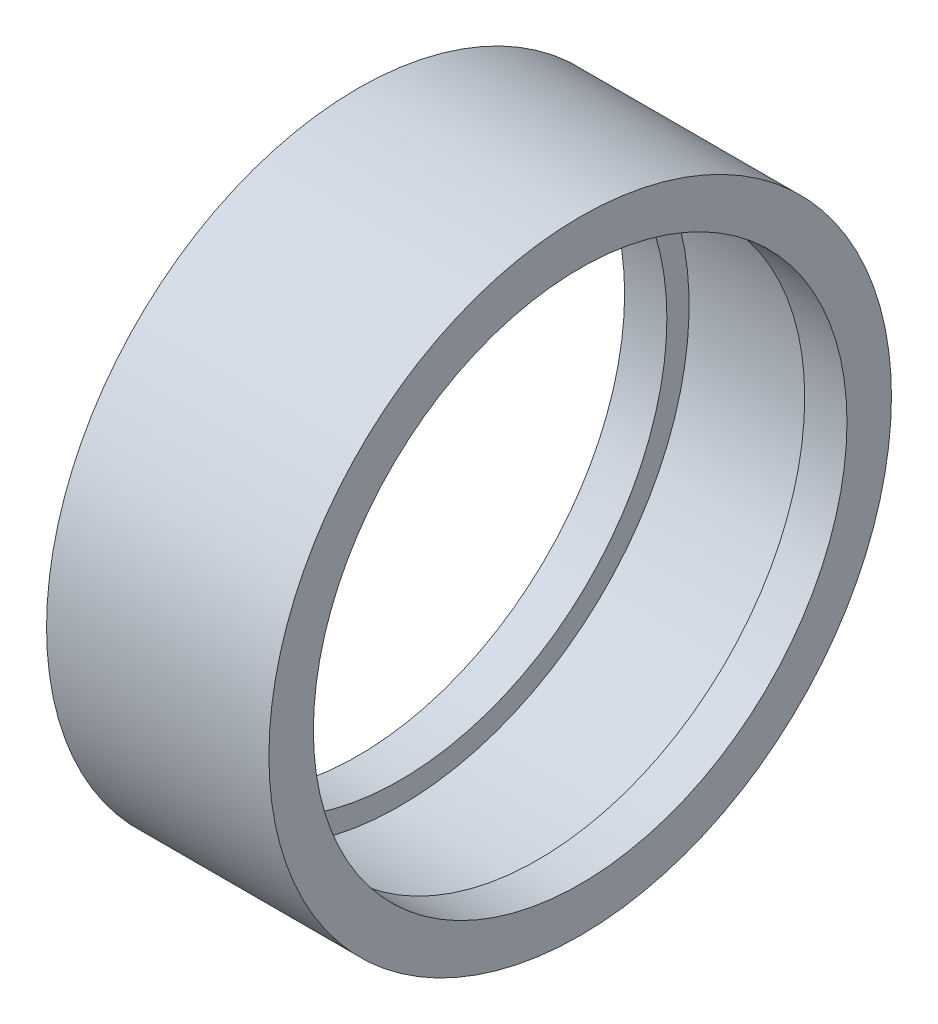
ISO-10303-21;
HEADER;
FILE_DESCRIPTION(('STEP AP214'),'2;1');
FILE_NAME('part.step','',(''),(''),'','','');
FILE_SCHEMA(('AUTOMOTIVE_DESIGN { 1 0 10303 214 1 1 1 1 }'));
ENDSEC;
DATA;
#1=APPLICATION_CONTEXT('core data for automotive mechanical design processes');
#2=APPLICATION_PROTOCOL_DEFINITION('international standard','automotive_design',2000,#1);
#3=PRODUCT_CONTEXT('',#1,'mechanical');
#4=PRODUCT('Part','Part','',(#3));
#5=PRODUCT_RELATED_PRODUCT_CATEGORY('part','',(#4));
#6=PRODUCT_DEFINITION_FORMATION('','',#4);
#7=PRODUCT_DEFINITION_CONTEXT('part definition',#1,'design');
#8=PRODUCT_DEFINITION('design','',#6,#7);
#9=PRODUCT_DEFINITION_SHAPE('','',#8);
#10=(LENGTH_UNIT() NAMED_UNIT(*) SI_UNIT(.MILLI.,.METRE.));
#11=(NAMED_UNIT(*) PLANE_ANGLE_UNIT() SI_UNIT($,.RADIAN.));
#12=(NAMED_UNIT(*) SI_UNIT($,.STERADIAN.) SOLID_ANGLE_UNIT());
#13=UNCERTAINTY_MEASURE_WITH_UNIT(LENGTH_MEASURE(1.E-05),#10,'distance_accuracy_value','');
#14=(GEOMETRIC_REPRESENTATION_CONTEXT(3) GLOBAL_UNCERTAINTY_ASSIGNED_CONTEXT((#13)) GLOBAL_UNIT_ASSIGNED_CONTEXT((#10,
#11,#12)) REPRESENTATION_CONTEXT('',''));
#15=CARTESIAN_POINT('',(0.,0.,0.));
#16=DIRECTION('',(0.,0.,1.));
#17=DIRECTION('',(1.,0.,0.));
#18=AXIS2_PLACEMENT_3D('',#15,#16,#17);
#19=CARTESIAN_POINT('',(102.335025380711,70.,0.));
#20=DIRECTION('',(-1.,0.,0.));
#21=DIRECTION('',(0.,0.,1.));
#22=AXIS2_PLACEMENT_3D('',#19,#20,#21);
#23=PLANE('',#22);
#24=CARTESIAN_POINT('',(102.335025380711,0.,0.));
#25=DIRECTION('',(-1.,0.,0.));
#26=DIRECTION('',(0.,0.,1.));
#27=AXIS2_PLACEMENT_3D('',#24,#25,#26);
#28=CIRCLE('',#27,70.);
#29=CARTESIAN_POINT('',(102.335025380711,0.,70.));
#30=VERTEX_POINT('',#29);
#31=EDGE_CURVE('E10',#30,#30,#28,.T.);
#32=ORIENTED_EDGE('',*,*,#31,.F.);
#33=EDGE_LOOP('',(#32));
#34=FACE_BOUND('',#33,.T.);
#35=CARTESIAN_POINT('',(102.335025380711,0.,0.));
#36=DIRECTION('',(-1.,0.,0.));
#37=DIRECTION('',(0.,0.,1.));
#38=AXIS2_PLACEMENT_3D('',#35,#36,#37);
#39=CIRCLE('',#38,60.);
#40=CARTESIAN_POINT('',(102.335025380711,0.,60.));
#41=VERTEX_POINT('',#40);
#42=EDGE_CURVE('E58',#41,#41,#39,.T.);
#43=ORIENTED_EDGE('',*,*,#42,.T.);
#44=EDGE_LOOP('',(#43));
#45=FACE_BOUND('',#44,.T.);
#46=ADVANCED_FACE('F30',(#34,#45),#23,.F.);
#47=CARTESIAN_POINT('',(-182.741116751269,0.,0.));
#48=DIRECTION('',(-1.,0.,0.));
#49=DIRECTION('',(0.,0.,1.));
#50=AXIS2_PLACEMENT_3D('',#47,#48,#49);
#51=CYLINDRICAL_SURFACE('',#50,70.);
#52=CARTESIAN_POINT('',(52.3350253807106,0.,0.));
#53=DIRECTION('',(-1.,0.,0.));
#54=DIRECTION('',(0.,0.,1.));
#55=AXIS2_PLACEMENT_3D('',#52,#53,#54);
#56=CIRCLE('',#55,70.);
#57=CARTESIAN_POINT('',(52.3350253807106,0.,70.));
#58=VERTEX_POINT('',#57);
#59=EDGE_CURVE('E36',#58,#58,#56,.T.);
#60=ORIENTED_EDGE('',*,*,#59,.F.);
#61=EDGE_LOOP('',(#60));
#62=FACE_BOUND('',#61,.T.);
#63=ORIENTED_EDGE('',*,*,#31,.T.);
#64=EDGE_LOOP('',(#63));
#65=FACE_BOUND('',#64,.T.);
#66=ADVANCED_FACE('F95',(#62,#65),#51,.T.);
#67=CARTESIAN_POINT('',(52.3350253807106,70.,0.));
#68=DIRECTION('',(1.,0.,0.));
#69=DIRECTION('',(0.,0.,-1.));
#70=AXIS2_PLACEMENT_3D('',#67,#68,#69);
#71=PLANE('',#70);
#72=CARTESIAN_POINT('',(52.3350253807106,0.,0.));
#73=DIRECTION('',(-1.,0.,0.));
#74=DIRECTION('',(0.,0.,1.));
#75=AXIS2_PLACEMENT_3D('',#72,#73,#74);
#76=CIRCLE('',#75,60.);
#77=CARTESIAN_POINT('',(52.3350253807106,0.,60.));
#78=VERTEX_POINT('',#77);
#79=EDGE_CURVE('E40',#78,#78,#76,.T.);
#80=ORIENTED_EDGE('',*,*,#79,.F.);
#81=EDGE_LOOP('',(#80));
#82=FACE_BOUND('',#81,.T.);
#83=ORIENTED_EDGE('',*,*,#59,.T.);
#84=EDGE_LOOP('',(#83));
#85=FACE_BOUND('',#84,.T.);
#86=ADVANCED_FACE('F90',(#82,#85),#71,.F.);
#87=CARTESIAN_POINT('',(-182.741116751269,0.,0.));
#88=DIRECTION('',(-1.,0.,0.));
#89=DIRECTION('',(0.,0.,1.));
#90=AXIS2_PLACEMENT_3D('',#87,#88,#89);
#91=CYLINDRICAL_SURFACE('',#90,60.);
#92=CARTESIAN_POINT('',(61.8350253807106,0.,0.));
#93=DIRECTION('',(-1.,0.,0.));
#94=DIRECTION('',(0.,0.,1.));
#95=AXIS2_PLACEMENT_3D('',#92,#93,#94);
#96=CIRCLE('',#95,60.);
#97=CARTESIAN_POINT('',(61.8350253807106,0.,60.));
#98=VERTEX_POINT('',#97);
#99=EDGE_CURVE('E44',#98,#98,#96,.T.);
#100=ORIENTED_EDGE('',*,*,#99,.F.);
#101=EDGE_LOOP('',(#100));
#102=FACE_BOUND('',#101,.T.);
#103=ORIENTED_EDGE('',*,*,#79,.T.);
#104=EDGE_LOOP('',(#103));
#105=FACE_BOUND('',#104,.T.);
#106=ADVANCED_FACE('F84',(#102,#105),#91,.F.);
#107=CARTESIAN_POINT('',(61.8350253807106,65.,0.));
#108=DIRECTION('',(-1.,0.,0.));
#109=DIRECTION('',(0.,0.,1.));
#110=AXIS2_PLACEMENT_3D('',#107,#108,#109);
#111=PLANE('',#110);
#112=CARTESIAN_POINT('',(61.8350253807106,0.,0.));
#113=DIRECTION('',(-1.,0.,0.));
#114=DIRECTION('',(0.,0.,1.));
#115=AXIS2_PLACEMENT_3D('',#112,#113,#114);
#116=CIRCLE('',#115,65.);
#117=CARTESIAN_POINT('',(61.8350253807106,0.,65.));
#118=VERTEX_POINT('',#117);
#119=EDGE_CURVE('E49',#118,#118,#116,.T.);
#120=ORIENTED_EDGE('',*,*,#119,.F.);
#121=EDGE_LOOP('',(#120));
#122=FACE_BOUND('',#121,.T.);
#123=ORIENTED_EDGE('',*,*,#99,.T.);
#124=EDGE_LOOP('',(#123));
#125=FACE_BOUND('',#124,.T.);
#126=ADVANCED_FACE('F78',(#122,#125),#111,.F.);
#127=CARTESIAN_POINT('',(-182.741116751269,0.,0.));
#128=DIRECTION('',(-1.,0.,0.));
#129=DIRECTION('',(0.,0.,1.));
#130=AXIS2_PLACEMENT_3D('',#127,#128,#129);
#131=CYLINDRICAL_SURFACE('',#130,65.);
#132=CARTESIAN_POINT('',(92.8350253807107,0.,0.));
#133=DIRECTION('',(-1.,0.,0.));
#134=DIRECTION('',(0.,0.,1.));
#135=AXIS2_PLACEMENT_3D('',#132,#133,#134);
#136=CIRCLE('',#135,65.);
#137=CARTESIAN_POINT('',(92.8350253807107,0.,65.));
#138=VERTEX_POINT('',#137);
#139=EDGE_CURVE('E52',#138,#138,#136,.T.);
#140=ORIENTED_EDGE('',*,*,#139,.F.);
#141=EDGE_LOOP('',(#140));
#142=FACE_BOUND('',#141,.T.);
#143=ORIENTED_EDGE('',*,*,#119,.T.);
#144=EDGE_LOOP('',(#143));
#145=FACE_BOUND('',#144,.T.);
#146=ADVANCED_FACE('F72',(#142,#145),#131,.F.);
#147=CARTESIAN_POINT('',(92.8350253807106,65.,0.));
#148=DIRECTION('',(1.,0.,0.));
#149=DIRECTION('',(0.,0.,-1.));
#150=AXIS2_PLACEMENT_3D('',#147,#148,#149);
#151=PLANE('',#150);
#152=CARTESIAN_POINT('',(92.8350253807107,0.,0.));
#153=DIRECTION('',(-1.,0.,0.));
#154=DIRECTION('',(0.,0.,1.));
#155=AXIS2_PLACEMENT_3D('',#152,#153,#154);
#156=CIRCLE('',#155,60.);
#157=CARTESIAN_POINT('',(92.8350253807107,0.,60.));
#158=VERTEX_POINT('',#157);
#159=EDGE_CURVE('E55',#158,#158,#156,.T.);
#160=ORIENTED_EDGE('',*,*,#159,.F.);
#161=EDGE_LOOP('',(#160));
#162=FACE_BOUND('',#161,.T.);
#163=ORIENTED_EDGE('',*,*,#139,.T.);
#164=EDGE_LOOP('',(#163));
#165=FACE_BOUND('',#164,.T.);
#166=ADVANCED_FACE('F66',(#162,#165),#151,.F.);
#167=CARTESIAN_POINT('',(-182.741116751269,0.,0.));
#168=DIRECTION('',(-1.,0.,0.));
#169=DIRECTION('',(0.,0.,1.));
#170=AXIS2_PLACEMENT_3D('',#167,#168,#169);
#171=CYLINDRICAL_SURFACE('',#170,60.);
#172=ORIENTED_EDGE('',*,*,#42,.F.);
#173=EDGE_LOOP('',(#172));
#174=FACE_BOUND('',#173,.T.);
#175=ORIENTED_EDGE('',*,*,#159,.T.);
#176=EDGE_LOOP('',(#175));
#177=FACE_BOUND('',#176,.T.);
#178=ADVANCED_FACE('F63',(#174,#177),#171,.F.);
#179=CLOSED_SHELL('',(#46,#66,#86,#106,#126,#146,#166,#178));
#180=MANIFOLD_SOLID_BREP('B2',#179);
#181=ADVANCED_BREP_SHAPE_REPRESENTATION('',(#18,#180),#14);
#182=SHAPE_DEFINITION_REPRESENTATION(#9,#181);
ENDSEC;
END-ISO-10303-21;
